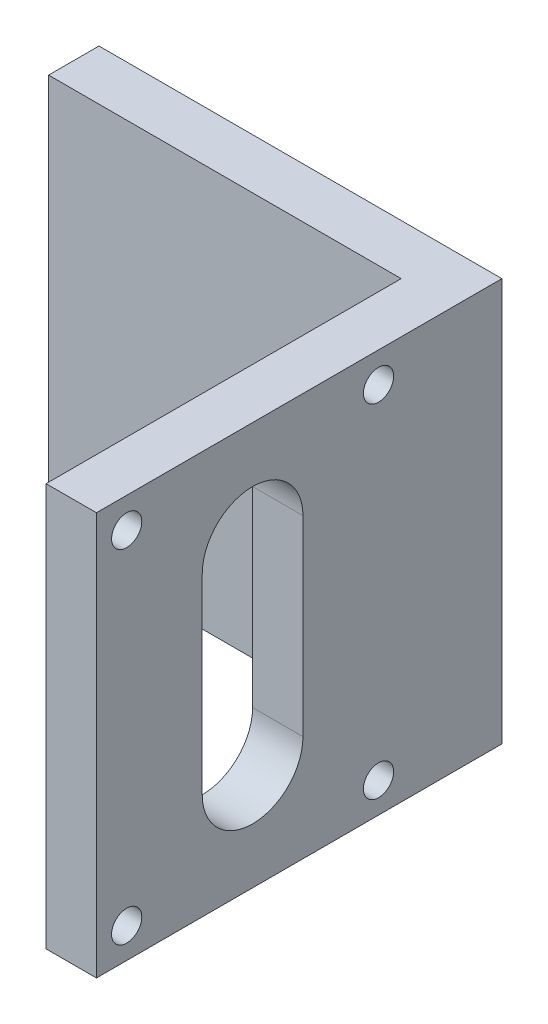
ISO-10303-21;
HEADER;
FILE_DESCRIPTION(('STEP AP214'),'2;1');
FILE_NAME('part.step','',(''),(''),'','','');
FILE_SCHEMA(('AUTOMOTIVE_DESIGN { 1 0 10303 214 1 1 1 1 }'));
ENDSEC;
DATA;
#1=APPLICATION_CONTEXT('core data for automotive mechanical design processes');
#2=APPLICATION_PROTOCOL_DEFINITION('international standard','automotive_design',2000,#1);
#3=PRODUCT_CONTEXT('',#1,'mechanical');
#4=PRODUCT('Part','Part','',(#3));
#5=PRODUCT_RELATED_PRODUCT_CATEGORY('part','',(#4));
#6=PRODUCT_DEFINITION_FORMATION('','',#4);
#7=PRODUCT_DEFINITION_CONTEXT('part definition',#1,'design');
#8=PRODUCT_DEFINITION('design','',#6,#7);
#9=PRODUCT_DEFINITION_SHAPE('','',#8);
#10=(LENGTH_UNIT() NAMED_UNIT(*) SI_UNIT(.MILLI.,.METRE.));
#11=(NAMED_UNIT(*) PLANE_ANGLE_UNIT() SI_UNIT($,.RADIAN.));
#12=(NAMED_UNIT(*) SI_UNIT($,.STERADIAN.) SOLID_ANGLE_UNIT());
#13=UNCERTAINTY_MEASURE_WITH_UNIT(LENGTH_MEASURE(1.E-05),#10,'distance_accuracy_value','');
#14=(GEOMETRIC_REPRESENTATION_CONTEXT(3) GLOBAL_UNCERTAINTY_ASSIGNED_CONTEXT((#13)) GLOBAL_UNIT_ASSIGNED_CONTEXT((#10,
#11,#12)) REPRESENTATION_CONTEXT('',''));
#15=CARTESIAN_POINT('',(0.,0.,0.));
#16=DIRECTION('',(0.,0.,1.));
#17=DIRECTION('',(1.,0.,0.));
#18=AXIS2_PLACEMENT_3D('',#15,#16,#17);
#19=CARTESIAN_POINT('',(0.,80.,0.));
#20=DIRECTION('',(0.,0.,-1.));
#21=DIRECTION('',(-1.,0.,0.));
#22=AXIS2_PLACEMENT_3D('',#19,#20,#21);
#23=PLANE('',#22);
#24=DIRECTION('',(1.,0.,0.));
#25=VECTOR('',#24,1.);
#26=CARTESIAN_POINT('',(0.,0.,0.));
#27=LINE('',#26,#25);
#28=CARTESIAN_POINT('',(-10.,0.,0.));
#29=VERTEX_POINT('',#28);
#30=CARTESIAN_POINT('',(0.,0.,0.));
#31=VERTEX_POINT('',#30);
#32=EDGE_CURVE('E193',#29,#31,#27,.T.);
#33=ORIENTED_EDGE('',*,*,#32,.T.);
#34=DIRECTION('',(0.,-1.,0.));
#35=VECTOR('',#34,1.);
#36=CARTESIAN_POINT('',(0.,80.,0.));
#37=LINE('',#36,#35);
#38=CARTESIAN_POINT('',(0.,80.,0.));
#39=VERTEX_POINT('',#38);
#40=EDGE_CURVE('E11',#39,#31,#37,.T.);
#41=ORIENTED_EDGE('',*,*,#40,.F.);
#42=DIRECTION('',(1.,0.,0.));
#43=VECTOR('',#42,1.);
#44=CARTESIAN_POINT('',(0.,80.,0.));
#45=LINE('',#44,#43);
#46=CARTESIAN_POINT('',(-10.,80.,0.));
#47=VERTEX_POINT('',#46);
#48=EDGE_CURVE('E197',#47,#39,#45,.T.);
#49=ORIENTED_EDGE('',*,*,#48,.F.);
#50=DIRECTION('',(0.,-1.,0.));
#51=VECTOR('',#50,1.);
#52=CARTESIAN_POINT('',(-10.,80.,0.));
#53=LINE('',#52,#51);
#54=EDGE_CURVE('E217',#47,#29,#53,.T.);
#55=ORIENTED_EDGE('',*,*,#54,.T.);
#56=EDGE_LOOP('',(#33,#41,#49,#55));
#57=FACE_BOUND('',#56,.T.);
#58=ADVANCED_FACE('F39',(#57),#23,.F.);
#59=CARTESIAN_POINT('',(0.,80.,0.));
#60=DIRECTION('',(-1.,0.,0.));
#61=DIRECTION('',(0.,0.,1.));
#62=AXIS2_PLACEMENT_3D('',#59,#60,#61);
#63=PLANE('',#62);
#64=DIRECTION('',(0.,1.,0.));
#65=VECTOR('',#64,1.);
#66=CARTESIAN_POINT('',(0.,0.,-21.));
#67=LINE('',#66,#65);
#68=CARTESIAN_POINT('',(0.,21.,-21.));
#69=VERTEX_POINT('',#68);
#70=CARTESIAN_POINT('',(0.,59.,-21.));
#71=VERTEX_POINT('',#70);
#72=EDGE_CURVE('E150',#69,#71,#67,.T.);
#73=ORIENTED_EDGE('',*,*,#72,.T.);
#74=CARTESIAN_POINT('',(0.,59.,-31.));
#75=DIRECTION('',(1.,0.,0.));
#76=DIRECTION('',(0.,0.,-1.));
#77=AXIS2_PLACEMENT_3D('',#74,#75,#76);
#78=CIRCLE('',#77,10.);
#79=CARTESIAN_POINT('',(0.,59.,-41.));
#80=VERTEX_POINT('',#79);
#81=EDGE_CURVE('E54',#80,#71,#78,.T.);
#82=ORIENTED_EDGE('',*,*,#81,.F.);
#83=DIRECTION('',(0.,-1.,0.));
#84=VECTOR('',#83,1.);
#85=CARTESIAN_POINT('',(0.,0.,-41.));
#86=LINE('',#85,#84);
#87=CARTESIAN_POINT('',(0.,21.,-41.));
#88=VERTEX_POINT('',#87);
#89=EDGE_CURVE('E137',#80,#88,#86,.T.);
#90=ORIENTED_EDGE('',*,*,#89,.T.);
#91=CARTESIAN_POINT('',(0.,21.,-31.));
#92=DIRECTION('',(1.,0.,0.));
#93=DIRECTION('',(0.,0.,-1.));
#94=AXIS2_PLACEMENT_3D('',#91,#92,#93);
#95=CIRCLE('',#94,10.);
#96=EDGE_CURVE('E141',#69,#88,#95,.T.);
#97=ORIENTED_EDGE('',*,*,#96,.F.);
#98=EDGE_LOOP('',(#73,#82,#90,#97));
#99=FACE_BOUND('',#98,.T.);
#100=CARTESIAN_POINT('',(0.,74.,-6.));
#101=DIRECTION('',(1.,0.,0.));
#102=DIRECTION('',(0.,0.,-1.));
#103=AXIS2_PLACEMENT_3D('',#100,#101,#102);
#104=CIRCLE('',#103,3.);
#105=CARTESIAN_POINT('',(0.,74.,-9.));
#106=VERTEX_POINT('',#105);
#107=EDGE_CURVE('E178',#106,#106,#104,.T.);
#108=ORIENTED_EDGE('',*,*,#107,.F.);
#109=EDGE_LOOP('',(#108));
#110=FACE_BOUND('',#109,.T.);
#111=CARTESIAN_POINT('',(0.,6.,-56.));
#112=DIRECTION('',(1.,0.,0.));
#113=DIRECTION('',(0.,0.,-1.));
#114=AXIS2_PLACEMENT_3D('',#111,#112,#113);
#115=CIRCLE('',#114,3.);
#116=CARTESIAN_POINT('',(0.,6.,-59.));
#117=VERTEX_POINT('',#116);
#118=EDGE_CURVE('E169',#117,#117,#115,.T.);
#119=ORIENTED_EDGE('',*,*,#118,.F.);
#120=EDGE_LOOP('',(#119));
#121=FACE_BOUND('',#120,.T.);
#122=CARTESIAN_POINT('',(0.,6.,-6.));
#123=DIRECTION('',(1.,0.,0.));
#124=DIRECTION('',(0.,0.,-1.));
#125=AXIS2_PLACEMENT_3D('',#122,#123,#124);
#126=CIRCLE('',#125,3.);
#127=CARTESIAN_POINT('',(0.,6.,-9.));
#128=VERTEX_POINT('',#127);
#129=EDGE_CURVE('E159',#128,#128,#126,.T.);
#130=ORIENTED_EDGE('',*,*,#129,.F.);
#131=EDGE_LOOP('',(#130));
#132=FACE_BOUND('',#131,.T.);
#133=CARTESIAN_POINT('',(0.,74.,-56.));
#134=DIRECTION('',(1.,0.,0.));
#135=DIRECTION('',(0.,0.,-1.));
#136=AXIS2_PLACEMENT_3D('',#133,#134,#135);
#137=CIRCLE('',#136,3.);
#138=CARTESIAN_POINT('',(0.,74.,-59.));
#139=VERTEX_POINT('',#138);
#140=EDGE_CURVE('E177',#139,#139,#137,.T.);
#141=ORIENTED_EDGE('',*,*,#140,.F.);
#142=EDGE_LOOP('',(#141));
#143=FACE_BOUND('',#142,.T.);
#144=DIRECTION('',(0.,0.,-1.));
#145=VECTOR('',#144,1.);
#146=CARTESIAN_POINT('',(0.,0.,0.));
#147=LINE('',#146,#145);
#148=CARTESIAN_POINT('',(0.,0.,-80.5));
#149=VERTEX_POINT('',#148);
#150=EDGE_CURVE('E221',#31,#149,#147,.T.);
#151=ORIENTED_EDGE('',*,*,#150,.T.);
#152=DIRECTION('',(0.,-1.,0.));
#153=VECTOR('',#152,1.);
#154=CARTESIAN_POINT('',(0.,80.,-80.5));
#155=LINE('',#154,#153);
#156=CARTESIAN_POINT('',(0.,80.,-80.5));
#157=VERTEX_POINT('',#156);
#158=EDGE_CURVE('E47',#157,#149,#155,.T.);
#159=ORIENTED_EDGE('',*,*,#158,.F.);
#160=DIRECTION('',(0.,0.,-1.));
#161=VECTOR('',#160,1.);
#162=CARTESIAN_POINT('',(0.,80.,0.));
#163=LINE('',#162,#161);
#164=EDGE_CURVE('E201',#39,#157,#163,.T.);
#165=ORIENTED_EDGE('',*,*,#164,.F.);
#166=ORIENTED_EDGE('',*,*,#40,.T.);
#167=EDGE_LOOP('',(#151,#159,#165,#166));
#168=FACE_BOUND('',#167,.T.);
#169=ADVANCED_FACE('F278',(#99,#110,#121,#132,#143,#168),#63,.F.);
#170=CARTESIAN_POINT('',(0.,80.,-80.5));
#171=DIRECTION('',(0.,0.,1.));
#172=DIRECTION('',(1.,0.,0.));
#173=AXIS2_PLACEMENT_3D('',#170,#171,#172);
#174=PLANE('',#173);
#175=DIRECTION('',(-1.,0.,0.));
#176=VECTOR('',#175,1.);
#177=CARTESIAN_POINT('',(0.,0.,-80.5));
#178=LINE('',#177,#176);
#179=CARTESIAN_POINT('',(-80.0000000000001,0.,-80.5));
#180=VERTEX_POINT('',#179);
#181=EDGE_CURVE('E224',#149,#180,#178,.T.);
#182=ORIENTED_EDGE('',*,*,#181,.T.);
#183=DIRECTION('',(0.,-1.,0.));
#184=VECTOR('',#183,1.);
#185=CARTESIAN_POINT('',(-80.0000000000001,80.,-80.5));
#186=LINE('',#185,#184);
#187=CARTESIAN_POINT('',(-80.0000000000001,80.,-80.5));
#188=VERTEX_POINT('',#187);
#189=EDGE_CURVE('E246',#188,#180,#186,.T.);
#190=ORIENTED_EDGE('',*,*,#189,.F.);
#191=DIRECTION('',(-1.,0.,0.));
#192=VECTOR('',#191,1.);
#193=CARTESIAN_POINT('',(0.,80.,-80.5));
#194=LINE('',#193,#192);
#195=EDGE_CURVE('E205',#157,#188,#194,.T.);
#196=ORIENTED_EDGE('',*,*,#195,.F.);
#197=ORIENTED_EDGE('',*,*,#158,.T.);
#198=EDGE_LOOP('',(#182,#190,#196,#197));
#199=FACE_BOUND('',#198,.T.);
#200=ADVANCED_FACE('F255',(#199),#174,.F.);
#201=CARTESIAN_POINT('',(-80.0000000000001,80.,-80.5));
#202=DIRECTION('',(1.,0.,0.));
#203=DIRECTION('',(0.,0.,-1.));
#204=AXIS2_PLACEMENT_3D('',#201,#202,#203);
#205=PLANE('',#204);
#206=DIRECTION('',(0.,0.,1.));
#207=VECTOR('',#206,1.);
#208=CARTESIAN_POINT('',(-80.0000000000001,0.,-80.5));
#209=LINE('',#208,#207);
#210=CARTESIAN_POINT('',(-80.0000000000001,0.,-70.5));
#211=VERTEX_POINT('',#210);
#212=EDGE_CURVE('E227',#180,#211,#209,.T.);
#213=ORIENTED_EDGE('',*,*,#212,.T.);
#214=DIRECTION('',(0.,-1.,0.));
#215=VECTOR('',#214,1.);
#216=CARTESIAN_POINT('',(-80.0000000000001,80.,-70.5));
#217=LINE('',#216,#215);
#218=CARTESIAN_POINT('',(-80.0000000000001,80.,-70.5));
#219=VERTEX_POINT('',#218);
#220=EDGE_CURVE('E242',#219,#211,#217,.T.);
#221=ORIENTED_EDGE('',*,*,#220,.F.);
#222=DIRECTION('',(0.,0.,1.));
#223=VECTOR('',#222,1.);
#224=CARTESIAN_POINT('',(-80.0000000000001,80.,-80.5));
#225=LINE('',#224,#223);
#226=EDGE_CURVE('E208',#188,#219,#225,.T.);
#227=ORIENTED_EDGE('',*,*,#226,.F.);
#228=ORIENTED_EDGE('',*,*,#189,.T.);
#229=EDGE_LOOP('',(#213,#221,#227,#228));
#230=FACE_BOUND('',#229,.T.);
#231=ADVANCED_FACE('F266',(#230),#205,.F.);
#232=CARTESIAN_POINT('',(-80.0000000000001,80.,-70.5));
#233=DIRECTION('',(0.,0.,-1.));
#234=DIRECTION('',(-1.,0.,0.));
#235=AXIS2_PLACEMENT_3D('',#232,#233,#234);
#236=PLANE('',#235);
#237=DIRECTION('',(1.,0.,0.));
#238=VECTOR('',#237,1.);
#239=CARTESIAN_POINT('',(-80.0000000000001,0.,-70.5));
#240=LINE('',#239,#238);
#241=CARTESIAN_POINT('',(-10.,0.,-70.5));
#242=VERTEX_POINT('',#241);
#243=EDGE_CURVE('E230',#211,#242,#240,.T.);
#244=ORIENTED_EDGE('',*,*,#243,.T.);
#245=DIRECTION('',(0.,-1.,0.));
#246=VECTOR('',#245,1.);
#247=CARTESIAN_POINT('',(-10.,80.,-70.5));
#248=LINE('',#247,#246);
#249=CARTESIAN_POINT('',(-10.,80.,-70.5));
#250=VERTEX_POINT('',#249);
#251=EDGE_CURVE('E238',#250,#242,#248,.T.);
#252=ORIENTED_EDGE('',*,*,#251,.F.);
#253=DIRECTION('',(1.,0.,0.));
#254=VECTOR('',#253,1.);
#255=CARTESIAN_POINT('',(-80.0000000000001,80.,-70.5));
#256=LINE('',#255,#254);
#257=EDGE_CURVE('E211',#219,#250,#256,.T.);
#258=ORIENTED_EDGE('',*,*,#257,.F.);
#259=ORIENTED_EDGE('',*,*,#220,.T.);
#260=EDGE_LOOP('',(#244,#252,#258,#259));
#261=FACE_BOUND('',#260,.T.);
#262=ADVANCED_FACE('F270',(#261),#236,.F.);
#263=CARTESIAN_POINT('',(-10.,80.,-70.5));
#264=DIRECTION('',(1.,0.,0.));
#265=DIRECTION('',(0.,0.,-1.));
#266=AXIS2_PLACEMENT_3D('',#263,#264,#265);
#267=PLANE('',#266);
#268=DIRECTION('',(0.,-1.,0.));
#269=VECTOR('',#268,1.);
#270=CARTESIAN_POINT('',(-10.,0.,-41.));
#271=LINE('',#270,#269);
#272=CARTESIAN_POINT('',(-10.,59.,-41.));
#273=VERTEX_POINT('',#272);
#274=CARTESIAN_POINT('',(-10.,21.,-41.));
#275=VERTEX_POINT('',#274);
#276=EDGE_CURVE('E132',#273,#275,#271,.T.);
#277=ORIENTED_EDGE('',*,*,#276,.F.);
#278=CARTESIAN_POINT('',(-10.,59.,-31.));
#279=DIRECTION('',(1.,0.,0.));
#280=DIRECTION('',(0.,0.,-1.));
#281=AXIS2_PLACEMENT_3D('',#278,#279,#280);
#282=CIRCLE('',#281,10.);
#283=CARTESIAN_POINT('',(-10.,59.,-21.));
#284=VERTEX_POINT('',#283);
#285=EDGE_CURVE('E126',#273,#284,#282,.T.);
#286=ORIENTED_EDGE('',*,*,#285,.T.);
#287=DIRECTION('',(0.,1.,0.));
#288=VECTOR('',#287,1.);
#289=CARTESIAN_POINT('',(-10.,0.,-21.));
#290=LINE('',#289,#288);
#291=CARTESIAN_POINT('',(-10.,21.,-21.));
#292=VERTEX_POINT('',#291);
#293=EDGE_CURVE('E117',#292,#284,#290,.T.);
#294=ORIENTED_EDGE('',*,*,#293,.F.);
#295=CARTESIAN_POINT('',(-10.,21.,-31.));
#296=DIRECTION('',(1.,0.,0.));
#297=DIRECTION('',(0.,0.,-1.));
#298=AXIS2_PLACEMENT_3D('',#295,#296,#297);
#299=CIRCLE('',#298,10.);
#300=EDGE_CURVE('E62',#292,#275,#299,.T.);
#301=ORIENTED_EDGE('',*,*,#300,.T.);
#302=EDGE_LOOP('',(#277,#286,#294,#301));
#303=FACE_BOUND('',#302,.T.);
#304=CARTESIAN_POINT('',(-10.,74.,-6.));
#305=DIRECTION('',(1.,0.,0.));
#306=DIRECTION('',(0.,0.,-1.));
#307=AXIS2_PLACEMENT_3D('',#304,#305,#306);
#308=CIRCLE('',#307,3.);
#309=CARTESIAN_POINT('',(-10.,74.,-9.));
#310=VERTEX_POINT('',#309);
#311=EDGE_CURVE('E173',#310,#310,#308,.T.);
#312=ORIENTED_EDGE('',*,*,#311,.T.);
#313=EDGE_LOOP('',(#312));
#314=FACE_BOUND('',#313,.T.);
#315=CARTESIAN_POINT('',(-10.,6.,-56.));
#316=DIRECTION('',(1.,0.,0.));
#317=DIRECTION('',(0.,0.,-1.));
#318=AXIS2_PLACEMENT_3D('',#315,#316,#317);
#319=CIRCLE('',#318,3.);
#320=CARTESIAN_POINT('',(-10.,6.,-59.));
#321=VERTEX_POINT('',#320);
#322=EDGE_CURVE('E182',#321,#321,#319,.T.);
#323=ORIENTED_EDGE('',*,*,#322,.T.);
#324=EDGE_LOOP('',(#323));
#325=FACE_BOUND('',#324,.T.);
#326=CARTESIAN_POINT('',(-10.,6.,-6.));
#327=DIRECTION('',(1.,0.,0.));
#328=DIRECTION('',(0.,0.,-1.));
#329=AXIS2_PLACEMENT_3D('',#326,#327,#328);
#330=CIRCLE('',#329,3.);
#331=CARTESIAN_POINT('',(-10.,6.,-9.));
#332=VERTEX_POINT('',#331);
#333=EDGE_CURVE('E165',#332,#332,#330,.T.);
#334=ORIENTED_EDGE('',*,*,#333,.T.);
#335=EDGE_LOOP('',(#334));
#336=FACE_BOUND('',#335,.T.);
#337=CARTESIAN_POINT('',(-10.,74.,-56.));
#338=DIRECTION('',(1.,0.,0.));
#339=DIRECTION('',(0.,0.,-1.));
#340=AXIS2_PLACEMENT_3D('',#337,#338,#339);
#341=CIRCLE('',#340,3.);
#342=CARTESIAN_POINT('',(-10.,74.,-59.));
#343=VERTEX_POINT('',#342);
#344=EDGE_CURVE('E189',#343,#343,#341,.T.);
#345=ORIENTED_EDGE('',*,*,#344,.T.);
#346=EDGE_LOOP('',(#345));
#347=FACE_BOUND('',#346,.T.);
#348=DIRECTION('',(0.,0.,1.));
#349=VECTOR('',#348,1.);
#350=CARTESIAN_POINT('',(-10.,0.,-70.5));
#351=LINE('',#350,#349);
#352=EDGE_CURVE('E202',#242,#29,#351,.T.);
#353=ORIENTED_EDGE('',*,*,#352,.T.);
#354=ORIENTED_EDGE('',*,*,#54,.F.);
#355=DIRECTION('',(0.,0.,1.));
#356=VECTOR('',#355,1.);
#357=CARTESIAN_POINT('',(-10.,80.,-70.5));
#358=LINE('',#357,#356);
#359=EDGE_CURVE('E214',#250,#47,#358,.T.);
#360=ORIENTED_EDGE('',*,*,#359,.F.);
#361=ORIENTED_EDGE('',*,*,#251,.T.);
#362=EDGE_LOOP('',(#353,#354,#360,#361));
#363=FACE_BOUND('',#362,.T.);
#364=ADVANCED_FACE('F134',(#303,#314,#325,#336,#347,#363),#267,.F.);
#365=CARTESIAN_POINT('',(0.,80.,0.));
#366=DIRECTION('',(0.,1.,0.));
#367=DIRECTION('',(0.,0.,1.));
#368=AXIS2_PLACEMENT_3D('',#365,#366,#367);
#369=PLANE('',#368);
#370=ORIENTED_EDGE('',*,*,#48,.T.);
#371=ORIENTED_EDGE('',*,*,#164,.T.);
#372=ORIENTED_EDGE('',*,*,#195,.T.);
#373=ORIENTED_EDGE('',*,*,#226,.T.);
#374=ORIENTED_EDGE('',*,*,#257,.T.);
#375=ORIENTED_EDGE('',*,*,#359,.T.);
#376=EDGE_LOOP('',(#370,#371,#372,#373,#374,#375));
#377=FACE_BOUND('',#376,.T.);
#378=ADVANCED_FACE('F274',(#377),#369,.T.);
#379=CARTESIAN_POINT('',(0.,0.,0.));
#380=DIRECTION('',(0.,1.,0.));
#381=DIRECTION('',(0.,0.,1.));
#382=AXIS2_PLACEMENT_3D('',#379,#380,#381);
#383=PLANE('',#382);
#384=ORIENTED_EDGE('',*,*,#32,.F.);
#385=ORIENTED_EDGE('',*,*,#352,.F.);
#386=ORIENTED_EDGE('',*,*,#243,.F.);
#387=ORIENTED_EDGE('',*,*,#212,.F.);
#388=ORIENTED_EDGE('',*,*,#181,.F.);
#389=ORIENTED_EDGE('',*,*,#150,.F.);
#390=EDGE_LOOP('',(#384,#385,#386,#387,#388,#389));
#391=FACE_BOUND('',#390,.T.);
#392=ADVANCED_FACE('F261',(#391),#383,.F.);
#393=CARTESIAN_POINT('',(-10.,74.,-56.));
#394=DIRECTION('',(1.,0.,0.));
#395=DIRECTION('',(0.,0.,-1.));
#396=AXIS2_PLACEMENT_3D('',#393,#394,#395);
#397=CYLINDRICAL_SURFACE('',#396,3.);
#398=ORIENTED_EDGE('',*,*,#344,.F.);
#399=EDGE_LOOP('',(#398));
#400=FACE_BOUND('',#399,.T.);
#401=ORIENTED_EDGE('',*,*,#140,.T.);
#402=EDGE_LOOP('',(#401));
#403=FACE_BOUND('',#402,.T.);
#404=ADVANCED_FACE('F326',(#400,#403),#397,.F.);
#405=CARTESIAN_POINT('',(-10.,6.,-6.));
#406=DIRECTION('',(1.,0.,0.));
#407=DIRECTION('',(0.,0.,-1.));
#408=AXIS2_PLACEMENT_3D('',#405,#406,#407);
#409=CYLINDRICAL_SURFACE('',#408,3.);
#410=ORIENTED_EDGE('',*,*,#333,.F.);
#411=EDGE_LOOP('',(#410));
#412=FACE_BOUND('',#411,.T.);
#413=ORIENTED_EDGE('',*,*,#129,.T.);
#414=EDGE_LOOP('',(#413));
#415=FACE_BOUND('',#414,.T.);
#416=ADVANCED_FACE('F334',(#412,#415),#409,.F.);
#417=CARTESIAN_POINT('',(-10.,6.,-56.));
#418=DIRECTION('',(1.,0.,0.));
#419=DIRECTION('',(0.,0.,-1.));
#420=AXIS2_PLACEMENT_3D('',#417,#418,#419);
#421=CYLINDRICAL_SURFACE('',#420,3.);
#422=ORIENTED_EDGE('',*,*,#322,.F.);
#423=EDGE_LOOP('',(#422));
#424=FACE_BOUND('',#423,.T.);
#425=ORIENTED_EDGE('',*,*,#118,.T.);
#426=EDGE_LOOP('',(#425));
#427=FACE_BOUND('',#426,.T.);
#428=ADVANCED_FACE('F344',(#424,#427),#421,.F.);
#429=CARTESIAN_POINT('',(-10.,74.,-6.));
#430=DIRECTION('',(1.,0.,0.));
#431=DIRECTION('',(0.,0.,-1.));
#432=AXIS2_PLACEMENT_3D('',#429,#430,#431);
#433=CYLINDRICAL_SURFACE('',#432,3.);
#434=ORIENTED_EDGE('',*,*,#311,.F.);
#435=EDGE_LOOP('',(#434));
#436=FACE_BOUND('',#435,.T.);
#437=ORIENTED_EDGE('',*,*,#107,.T.);
#438=EDGE_LOOP('',(#437));
#439=FACE_BOUND('',#438,.T.);
#440=ADVANCED_FACE('F354',(#436,#439),#433,.F.);
#441=CARTESIAN_POINT('',(-10.,59.,-31.));
#442=DIRECTION('',(1.,0.,0.));
#443=DIRECTION('',(0.,0.,-1.));
#444=AXIS2_PLACEMENT_3D('',#441,#442,#443);
#445=CYLINDRICAL_SURFACE('',#444,10.);
#446=ORIENTED_EDGE('',*,*,#81,.T.);
#447=DIRECTION('',(1.,0.,0.));
#448=VECTOR('',#447,1.);
#449=CARTESIAN_POINT('',(-10.,59.,-21.));
#450=LINE('',#449,#448);
#451=EDGE_CURVE('E120',#284,#71,#450,.T.);
#452=ORIENTED_EDGE('',*,*,#451,.F.);
#453=ORIENTED_EDGE('',*,*,#285,.F.);
#454=DIRECTION('',(1.,0.,0.));
#455=VECTOR('',#454,1.);
#456=CARTESIAN_POINT('',(-10.,59.,-41.));
#457=LINE('',#456,#455);
#458=EDGE_CURVE('E156',#273,#80,#457,.T.);
#459=ORIENTED_EDGE('',*,*,#458,.T.);
#460=EDGE_LOOP('',(#446,#452,#453,#459));
#461=FACE_BOUND('',#460,.T.);
#462=ADVANCED_FACE('F129',(#461),#445,.F.);
#463=CARTESIAN_POINT('',(-10.,0.,-41.));
#464=DIRECTION('',(0.,0.,1.));
#465=DIRECTION('',(1.,0.,0.));
#466=AXIS2_PLACEMENT_3D('',#463,#464,#465);
#467=PLANE('',#466);
#468=ORIENTED_EDGE('',*,*,#89,.F.);
#469=ORIENTED_EDGE('',*,*,#458,.F.);
#470=ORIENTED_EDGE('',*,*,#276,.T.);
#471=DIRECTION('',(1.,0.,0.));
#472=VECTOR('',#471,1.);
#473=CARTESIAN_POINT('',(-10.,21.,-41.));
#474=LINE('',#473,#472);
#475=EDGE_CURVE('E160',#275,#88,#474,.T.);
#476=ORIENTED_EDGE('',*,*,#475,.T.);
#477=EDGE_LOOP('',(#468,#469,#470,#476));
#478=FACE_BOUND('',#477,.T.);
#479=ADVANCED_FACE('F382',(#478),#467,.T.);
#480=CARTESIAN_POINT('',(-10.,21.,-31.));
#481=DIRECTION('',(1.,0.,0.));
#482=DIRECTION('',(0.,0.,-1.));
#483=AXIS2_PLACEMENT_3D('',#480,#481,#482);
#484=CYLINDRICAL_SURFACE('',#483,10.);
#485=ORIENTED_EDGE('',*,*,#96,.T.);
#486=ORIENTED_EDGE('',*,*,#475,.F.);
#487=ORIENTED_EDGE('',*,*,#300,.F.);
#488=DIRECTION('',(1.,0.,0.));
#489=VECTOR('',#488,1.);
#490=CARTESIAN_POINT('',(-10.,21.,-21.));
#491=LINE('',#490,#489);
#492=EDGE_CURVE('E122',#292,#69,#491,.T.);
#493=ORIENTED_EDGE('',*,*,#492,.T.);
#494=EDGE_LOOP('',(#485,#486,#487,#493));
#495=FACE_BOUND('',#494,.T.);
#496=ADVANCED_FACE('F391',(#495),#484,.F.);
#497=CARTESIAN_POINT('',(-10.,0.,-21.));
#498=DIRECTION('',(0.,0.,-1.));
#499=DIRECTION('',(0.,1.,0.));
#500=AXIS2_PLACEMENT_3D('',#497,#498,#499);
#501=PLANE('',#500);
#502=ORIENTED_EDGE('',*,*,#72,.F.);
#503=ORIENTED_EDGE('',*,*,#492,.F.);
#504=ORIENTED_EDGE('',*,*,#293,.T.);
#505=ORIENTED_EDGE('',*,*,#451,.T.);
#506=EDGE_LOOP('',(#502,#503,#504,#505));
#507=FACE_BOUND('',#506,.T.);
#508=ADVANCED_FACE('F119',(#507),#501,.T.);
#509=CLOSED_SHELL('',(#58,#169,#200,#231,#262,#364,#378,#392,#404,#416,#428,#440,#462,#479,#496,#508));
#510=MANIFOLD_SOLID_BREP('B2',#509);
#511=ADVANCED_BREP_SHAPE_REPRESENTATION('',(#18,#510),#14);
#512=SHAPE_DEFINITION_REPRESENTATION(#9,#511);
ENDSEC;
END-ISO-10303-21;
